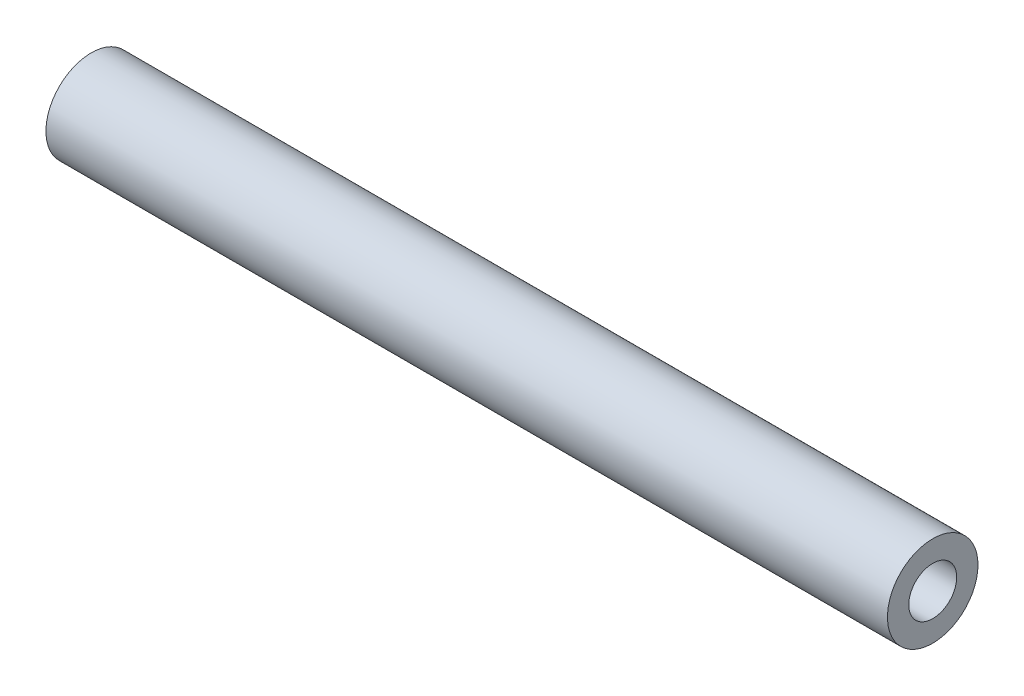
ISO-10303-21;
HEADER;
FILE_DESCRIPTION(('STEP AP214'),'2;1');
FILE_NAME('part.step','',(''),(''),'','','');
FILE_SCHEMA(('AUTOMOTIVE_DESIGN { 1 0 10303 214 1 1 1 1 }'));
ENDSEC;
DATA;
#1=APPLICATION_CONTEXT('core data for automotive mechanical design processes');
#2=APPLICATION_PROTOCOL_DEFINITION('international standard','automotive_design',2000,#1);
#3=PRODUCT_CONTEXT('',#1,'mechanical');
#4=PRODUCT('Part','Part','',(#3));
#5=PRODUCT_RELATED_PRODUCT_CATEGORY('part','',(#4));
#6=PRODUCT_DEFINITION_FORMATION('','',#4);
#7=PRODUCT_DEFINITION_CONTEXT('part definition',#1,'design');
#8=PRODUCT_DEFINITION('design','',#6,#7);
#9=PRODUCT_DEFINITION_SHAPE('','',#8);
#10=(LENGTH_UNIT() NAMED_UNIT(*) SI_UNIT(.MILLI.,.METRE.));
#11=(NAMED_UNIT(*) PLANE_ANGLE_UNIT() SI_UNIT($,.RADIAN.));
#12=(NAMED_UNIT(*) SI_UNIT($,.STERADIAN.) SOLID_ANGLE_UNIT());
#13=UNCERTAINTY_MEASURE_WITH_UNIT(LENGTH_MEASURE(1.E-05),#10,'distance_accuracy_value','');
#14=(GEOMETRIC_REPRESENTATION_CONTEXT(3) GLOBAL_UNCERTAINTY_ASSIGNED_CONTEXT((#13)) GLOBAL_UNIT_ASSIGNED_CONTEXT((#10,
#11,#12)) REPRESENTATION_CONTEXT('',''));
#15=CARTESIAN_POINT('',(0.,0.,0.));
#16=DIRECTION('',(0.,0.,1.));
#17=DIRECTION('',(1.,0.,0.));
#18=AXIS2_PLACEMENT_3D('',#15,#16,#17);
#19=CARTESIAN_POINT('',(-250.825,0.,0.));
#20=DIRECTION('',(1.,0.,0.));
#21=DIRECTION('',(0.,0.,-1.));
#22=AXIS2_PLACEMENT_3D('',#19,#20,#21);
#23=CYLINDRICAL_SURFACE('',#22,14.2875);
#24=CARTESIAN_POINT('',(250.825,0.,0.));
#25=DIRECTION('',(1.,0.,0.));
#26=DIRECTION('',(0.,0.,-1.));
#27=AXIS2_PLACEMENT_3D('',#24,#25,#26);
#28=CIRCLE('',#27,14.2875);
#29=CARTESIAN_POINT('',(250.825,0.,-14.2875));
#30=VERTEX_POINT('',#29);
#31=EDGE_CURVE('E17',#30,#30,#28,.F.);
#32=ORIENTED_EDGE('',*,*,#31,.F.);
#33=EDGE_LOOP('',(#32));
#34=FACE_BOUND('',#33,.T.);
#35=CARTESIAN_POINT('',(-250.825,0.,0.));
#36=DIRECTION('',(1.,0.,0.));
#37=DIRECTION('',(0.,0.,-1.));
#38=AXIS2_PLACEMENT_3D('',#35,#36,#37);
#39=CIRCLE('',#38,14.2875);
#40=CARTESIAN_POINT('',(-250.825,0.,-14.2875));
#41=VERTEX_POINT('',#40);
#42=EDGE_CURVE('E26',#41,#41,#39,.F.);
#43=ORIENTED_EDGE('',*,*,#42,.T.);
#44=EDGE_LOOP('',(#43));
#45=FACE_BOUND('',#44,.T.);
#46=ADVANCED_FACE('F14',(#34,#45),#23,.F.);
#47=CARTESIAN_POINT('',(250.825,0.,0.));
#48=DIRECTION('',(1.,0.,0.));
#49=DIRECTION('',(0.,0.,-1.));
#50=AXIS2_PLACEMENT_3D('',#47,#48,#49);
#51=PLANE('',#50);
#52=ORIENTED_EDGE('',*,*,#31,.T.);
#53=EDGE_LOOP('',(#52));
#54=FACE_BOUND('',#53,.T.);
#55=CARTESIAN_POINT('',(250.825,0.,0.));
#56=DIRECTION('',(1.,0.,0.));
#57=DIRECTION('',(0.,0.,-1.));
#58=AXIS2_PLACEMENT_3D('',#55,#56,#57);
#59=CIRCLE('',#58,26.9875);
#60=CARTESIAN_POINT('',(250.825,0.,-26.9875));
#61=VERTEX_POINT('',#60);
#62=EDGE_CURVE('E21',#61,#61,#59,.F.);
#63=ORIENTED_EDGE('',*,*,#62,.F.);
#64=EDGE_LOOP('',(#63));
#65=FACE_BOUND('',#64,.T.);
#66=ADVANCED_FACE('F34',(#54,#65),#51,.T.);
#67=CARTESIAN_POINT('',(-250.825,0.,0.));
#68=DIRECTION('',(1.,0.,0.));
#69=DIRECTION('',(0.,0.,-1.));
#70=AXIS2_PLACEMENT_3D('',#67,#68,#69);
#71=PLANE('',#70);
#72=ORIENTED_EDGE('',*,*,#42,.F.);
#73=EDGE_LOOP('',(#72));
#74=FACE_BOUND('',#73,.T.);
#75=CARTESIAN_POINT('',(-250.825,0.,0.));
#76=DIRECTION('',(1.,0.,0.));
#77=DIRECTION('',(0.,0.,-1.));
#78=AXIS2_PLACEMENT_3D('',#75,#76,#77);
#79=CIRCLE('',#78,26.9875);
#80=CARTESIAN_POINT('',(-250.825,0.,-26.9875));
#81=VERTEX_POINT('',#80);
#82=EDGE_CURVE('E10',#81,#81,#79,.T.);
#83=ORIENTED_EDGE('',*,*,#82,.F.);
#84=EDGE_LOOP('',(#83));
#85=FACE_BOUND('',#84,.T.);
#86=ADVANCED_FACE('F42',(#74,#85),#71,.F.);
#87=CARTESIAN_POINT('',(-250.825,0.,0.));
#88=DIRECTION('',(1.,0.,0.));
#89=DIRECTION('',(0.,0.,-1.));
#90=AXIS2_PLACEMENT_3D('',#87,#88,#89);
#91=CYLINDRICAL_SURFACE('',#90,26.9875);
#92=ORIENTED_EDGE('',*,*,#62,.T.);
#93=EDGE_LOOP('',(#92));
#94=FACE_BOUND('',#93,.T.);
#95=ORIENTED_EDGE('',*,*,#82,.T.);
#96=EDGE_LOOP('',(#95));
#97=FACE_BOUND('',#96,.T.);
#98=ADVANCED_FACE('F43',(#94,#97),#91,.T.);
#99=CLOSED_SHELL('',(#46,#66,#86,#98));
#100=MANIFOLD_SOLID_BREP('B1',#99);
#101=ADVANCED_BREP_SHAPE_REPRESENTATION('',(#18,#100),#14);
#102=SHAPE_DEFINITION_REPRESENTATION(#9,#101);
ENDSEC;
END-ISO-10303-21;
